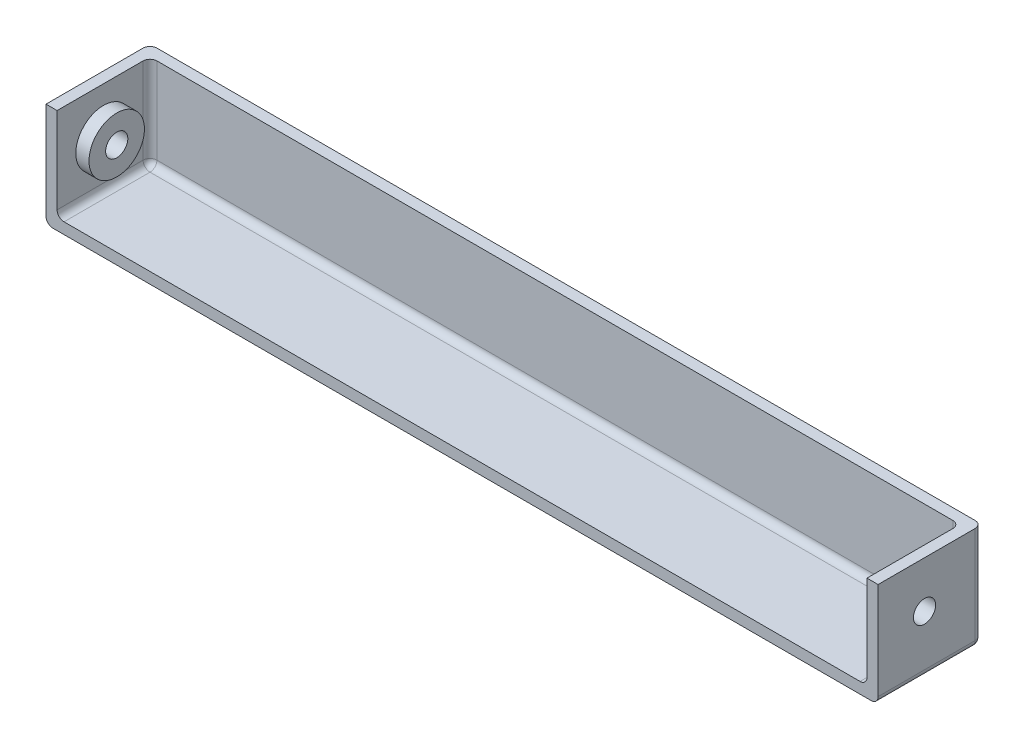
ISO-10303-21;
HEADER;
FILE_DESCRIPTION(('STEP AP214'),'2;1');
FILE_NAME('part.step','',(''),(''),'','','');
FILE_SCHEMA(('AUTOMOTIVE_DESIGN { 1 0 10303 214 1 1 1 1 }'));
ENDSEC;
DATA;
#1=APPLICATION_CONTEXT('core data for automotive mechanical design processes');
#2=APPLICATION_PROTOCOL_DEFINITION('international standard','automotive_design',2000,#1);
#3=PRODUCT_CONTEXT('',#1,'mechanical');
#4=PRODUCT('Part','Part','',(#3));
#5=PRODUCT_RELATED_PRODUCT_CATEGORY('part','',(#4));
#6=PRODUCT_DEFINITION_FORMATION('','',#4);
#7=PRODUCT_DEFINITION_CONTEXT('part definition',#1,'design');
#8=PRODUCT_DEFINITION('design','',#6,#7);
#9=PRODUCT_DEFINITION_SHAPE('','',#8);
#10=(LENGTH_UNIT() NAMED_UNIT(*) SI_UNIT(.MILLI.,.METRE.));
#11=(NAMED_UNIT(*) PLANE_ANGLE_UNIT() SI_UNIT($,.RADIAN.));
#12=(NAMED_UNIT(*) SI_UNIT($,.STERADIAN.) SOLID_ANGLE_UNIT());
#13=UNCERTAINTY_MEASURE_WITH_UNIT(LENGTH_MEASURE(1.E-05),#10,'distance_accuracy_value','');
#14=(GEOMETRIC_REPRESENTATION_CONTEXT(3) GLOBAL_UNCERTAINTY_ASSIGNED_CONTEXT((#13)) GLOBAL_UNIT_ASSIGNED_CONTEXT((#10,
#11,#12)) REPRESENTATION_CONTEXT('',''));
#15=CARTESIAN_POINT('',(0.,0.,0.));
#16=DIRECTION('',(0.,0.,1.));
#17=DIRECTION('',(1.,0.,0.));
#18=AXIS2_PLACEMENT_3D('',#15,#16,#17);
#19=CARTESIAN_POINT('',(-60.,0.,-1.6));
#20=DIRECTION('',(-1.,0.,0.));
#21=DIRECTION('',(0.,0.,1.));
#22=AXIS2_PLACEMENT_3D('',#19,#20,#21);
#23=PLANE('',#22);
#24=DIRECTION('',(0.,-1.,0.));
#25=VECTOR('',#24,1.);
#26=CARTESIAN_POINT('',(-60.,0.,-0.6));
#27=LINE('',#26,#25);
#28=CARTESIAN_POINT('',(-60.,15.,-0.6));
#29=VERTEX_POINT('',#28);
#30=CARTESIAN_POINT('',(-60.,1.,-0.6));
#31=VERTEX_POINT('',#30);
#32=EDGE_CURVE('E212',#29,#31,#27,.T.);
#33=ORIENTED_EDGE('',*,*,#32,.T.);
#34=DIRECTION('',(0.,0.,1.));
#35=VECTOR('',#34,1.);
#36=CARTESIAN_POINT('',(-60.,1.,-1.6));
#37=LINE('',#36,#35);
#38=CARTESIAN_POINT('',(-60.,1.,13.4));
#39=VERTEX_POINT('',#38);
#40=EDGE_CURVE('E176',#31,#39,#37,.T.);
#41=ORIENTED_EDGE('',*,*,#40,.T.);
#42=DIRECTION('',(0.,-1.,0.));
#43=VECTOR('',#42,1.);
#44=CARTESIAN_POINT('',(-60.,15.,13.4));
#45=LINE('',#44,#43);
#46=CARTESIAN_POINT('',(-60.,15.,13.4));
#47=VERTEX_POINT('',#46);
#48=EDGE_CURVE('E173',#47,#39,#45,.T.);
#49=ORIENTED_EDGE('',*,*,#48,.F.);
#50=DIRECTION('',(0.,0.,1.));
#51=VECTOR('',#50,1.);
#52=CARTESIAN_POINT('',(-60.,15.,-1.6));
#53=LINE('',#52,#51);
#54=EDGE_CURVE('E157',#29,#47,#53,.T.);
#55=ORIENTED_EDGE('',*,*,#54,.F.);
#56=EDGE_LOOP('',(#33,#41,#49,#55));
#57=FACE_BOUND('',#56,.T.);
#58=CARTESIAN_POINT('',(-60.,8.30000000000001,6.7));
#59=DIRECTION('',(-1.,0.,0.));
#60=DIRECTION('',(0.,-1.,0.));
#61=AXIS2_PLACEMENT_3D('',#58,#59,#60);
#62=CIRCLE('',#61,1.6);
#63=CARTESIAN_POINT('',(-60.,6.70000000000001,6.7));
#64=VERTEX_POINT('',#63);
#65=EDGE_CURVE('E348',#64,#64,#62,.T.);
#66=ORIENTED_EDGE('',*,*,#65,.F.);
#67=EDGE_LOOP('',(#66));
#68=FACE_BOUND('',#67,.T.);
#69=ADVANCED_FACE('F40',(#57,#68),#23,.T.);
#70=CARTESIAN_POINT('',(-56.5,8.30000000000001,6.7));
#71=DIRECTION('',(1.,0.,0.));
#72=DIRECTION('',(0.,-1.,0.));
#73=AXIS2_PLACEMENT_3D('',#70,#71,#72);
#74=PLANE('',#73);
#75=CARTESIAN_POINT('',(-56.5,8.30000000000001,6.7));
#76=DIRECTION('',(-1.,0.,0.));
#77=DIRECTION('',(0.,-1.,0.));
#78=AXIS2_PLACEMENT_3D('',#75,#76,#77);
#79=CIRCLE('',#78,4.);
#80=CARTESIAN_POINT('',(-56.5,4.30000000000001,6.7));
#81=VERTEX_POINT('',#80);
#82=EDGE_CURVE('E339',#81,#81,#79,.T.);
#83=ORIENTED_EDGE('',*,*,#82,.F.);
#84=EDGE_LOOP('',(#83));
#85=FACE_BOUND('',#84,.T.);
#86=CARTESIAN_POINT('',(-56.5,8.30000000000001,6.7));
#87=DIRECTION('',(-1.,0.,0.));
#88=DIRECTION('',(0.,-1.,0.));
#89=AXIS2_PLACEMENT_3D('',#86,#87,#88);
#90=CIRCLE('',#89,1.6);
#91=CARTESIAN_POINT('',(-56.5,6.70000000000001,6.7));
#92=VERTEX_POINT('',#91);
#93=EDGE_CURVE('E277',#92,#92,#90,.T.);
#94=ORIENTED_EDGE('',*,*,#93,.T.);
#95=EDGE_LOOP('',(#94));
#96=FACE_BOUND('',#95,.T.);
#97=ADVANCED_FACE('F359',(#85,#96),#74,.T.);
#98=CARTESIAN_POINT('',(58.4,15.,13.4));
#99=DIRECTION('',(1.,0.,0.));
#100=DIRECTION('',(0.,1.,0.));
#101=AXIS2_PLACEMENT_3D('',#98,#99,#100);
#102=PLANE('',#101);
#103=DIRECTION('',(0.,-1.,0.));
#104=VECTOR('',#103,1.);
#105=CARTESIAN_POINT('',(58.4,1.6,0.999999999999999));
#106=LINE('',#105,#104);
#107=CARTESIAN_POINT('',(58.4,15.,0.999999999999999));
#108=VERTEX_POINT('',#107);
#109=CARTESIAN_POINT('',(58.4,2.6,0.999999999999999));
#110=VERTEX_POINT('',#109);
#111=EDGE_CURVE('E238',#108,#110,#106,.T.);
#112=ORIENTED_EDGE('',*,*,#111,.T.);
#113=DIRECTION('',(0.,0.,-1.));
#114=VECTOR('',#113,1.);
#115=CARTESIAN_POINT('',(58.4,2.6,13.4));
#116=LINE('',#115,#114);
#117=CARTESIAN_POINT('',(58.4,2.6,13.4));
#118=VERTEX_POINT('',#117);
#119=EDGE_CURVE('E63',#110,#118,#116,.F.);
#120=ORIENTED_EDGE('',*,*,#119,.T.);
#121=DIRECTION('',(0.,-1.,0.));
#122=VECTOR('',#121,1.);
#123=CARTESIAN_POINT('',(58.4,15.,13.4));
#124=LINE('',#123,#122);
#125=CARTESIAN_POINT('',(58.4,15.,13.4));
#126=VERTEX_POINT('',#125);
#127=EDGE_CURVE('E182',#126,#118,#124,.T.);
#128=ORIENTED_EDGE('',*,*,#127,.F.);
#129=DIRECTION('',(0.,0.,-1.));
#130=VECTOR('',#129,1.);
#131=CARTESIAN_POINT('',(58.4,15.,13.4));
#132=LINE('',#131,#130);
#133=EDGE_CURVE('E192',#126,#108,#132,.T.);
#134=ORIENTED_EDGE('',*,*,#133,.T.);
#135=EDGE_LOOP('',(#112,#120,#128,#134));
#136=FACE_BOUND('',#135,.T.);
#137=CARTESIAN_POINT('',(58.4,8.30000000000001,6.7));
#138=DIRECTION('',(1.,0.,0.));
#139=DIRECTION('',(0.,1.,0.));
#140=AXIS2_PLACEMENT_3D('',#137,#138,#139);
#141=CIRCLE('',#140,4.);
#142=CARTESIAN_POINT('',(58.4,12.3,6.7));
#143=VERTEX_POINT('',#142);
#144=EDGE_CURVE('E168',#143,#143,#141,.F.);
#145=ORIENTED_EDGE('',*,*,#144,.F.);
#146=EDGE_LOOP('',(#145));
#147=FACE_BOUND('',#146,.T.);
#148=ADVANCED_FACE('F321',(#136,#147),#102,.F.);
#149=CARTESIAN_POINT('',(-60.,15.,0.));
#150=DIRECTION('',(0.,0.,-1.));
#151=DIRECTION('',(-1.,0.,0.));
#152=AXIS2_PLACEMENT_3D('',#149,#150,#151);
#153=PLANE('',#152);
#154=DIRECTION('',(1.,0.,0.));
#155=VECTOR('',#154,1.);
#156=CARTESIAN_POINT('',(-60.,2.6,0.));
#157=LINE('',#156,#155);
#158=CARTESIAN_POINT('',(-57.4,2.6,0.));
#159=VERTEX_POINT('',#158);
#160=CARTESIAN_POINT('',(57.4,2.6,0.));
#161=VERTEX_POINT('',#160);
#162=EDGE_CURVE('E243',#159,#161,#157,.T.);
#163=ORIENTED_EDGE('',*,*,#162,.T.);
#164=DIRECTION('',(0.,-1.,0.));
#165=VECTOR('',#164,1.);
#166=CARTESIAN_POINT('',(57.4,15.,0.));
#167=LINE('',#166,#165);
#168=CARTESIAN_POINT('',(57.4,15.,0.));
#169=VERTEX_POINT('',#168);
#170=EDGE_CURVE('E246',#161,#169,#167,.F.);
#171=ORIENTED_EDGE('',*,*,#170,.T.);
#172=DIRECTION('',(-1.,0.,0.));
#173=VECTOR('',#172,1.);
#174=CARTESIAN_POINT('',(-60.,15.,0.));
#175=LINE('',#174,#173);
#176=CARTESIAN_POINT('',(-57.4,15.,0.));
#177=VERTEX_POINT('',#176);
#178=EDGE_CURVE('E201',#169,#177,#175,.T.);
#179=ORIENTED_EDGE('',*,*,#178,.T.);
#180=DIRECTION('',(0.,-1.,0.));
#181=VECTOR('',#180,1.);
#182=CARTESIAN_POINT('',(-57.4,15.,0.));
#183=LINE('',#182,#181);
#184=EDGE_CURVE('E240',#177,#159,#183,.T.);
#185=ORIENTED_EDGE('',*,*,#184,.T.);
#186=EDGE_LOOP('',(#163,#171,#179,#185));
#187=FACE_BOUND('',#186,.T.);
#188=ADVANCED_FACE('F331',(#187),#153,.F.);
#189=CARTESIAN_POINT('',(-60.,15.,-1.6));
#190=DIRECTION('',(0.,1.,0.));
#191=DIRECTION('',(-1.,0.,0.));
#192=AXIS2_PLACEMENT_3D('',#189,#190,#191);
#193=PLANE('',#192);
#194=DIRECTION('',(-1.,0.,0.));
#195=VECTOR('',#194,1.);
#196=CARTESIAN_POINT('',(-60.,15.,-1.6));
#197=LINE('',#196,#195);
#198=CARTESIAN_POINT('',(59.,15.,-1.6));
#199=VERTEX_POINT('',#198);
#200=CARTESIAN_POINT('',(-59.,15.,-1.6));
#201=VERTEX_POINT('',#200);
#202=EDGE_CURVE('E202',#199,#201,#197,.T.);
#203=ORIENTED_EDGE('',*,*,#202,.T.);
#204=CARTESIAN_POINT('',(-59.,15.,-0.6));
#205=DIRECTION('',(0.,1.,0.));
#206=DIRECTION('',(-1.,0.,0.));
#207=AXIS2_PLACEMENT_3D('',#204,#205,#206);
#208=CIRCLE('',#207,1.);
#209=EDGE_CURVE('E165',#201,#29,#208,.T.);
#210=ORIENTED_EDGE('',*,*,#209,.T.);
#211=ORIENTED_EDGE('',*,*,#54,.T.);
#212=DIRECTION('',(1.,0.,0.));
#213=VECTOR('',#212,1.);
#214=CARTESIAN_POINT('',(-60.,15.,13.4));
#215=LINE('',#214,#213);
#216=CARTESIAN_POINT('',(-58.4,15.,13.4));
#217=VERTEX_POINT('',#216);
#218=EDGE_CURVE('E163',#47,#217,#215,.T.);
#219=ORIENTED_EDGE('',*,*,#218,.T.);
#220=DIRECTION('',(0.,0.,-1.));
#221=VECTOR('',#220,1.);
#222=CARTESIAN_POINT('',(-58.4,15.,13.4));
#223=LINE('',#222,#221);
#224=CARTESIAN_POINT('',(-58.4,15.,0.999999999999999));
#225=VERTEX_POINT('',#224);
#226=EDGE_CURVE('E177',#217,#225,#223,.T.);
#227=ORIENTED_EDGE('',*,*,#226,.T.);
#228=CARTESIAN_POINT('',(-57.4,15.,1.));
#229=DIRECTION('',(0.,1.,0.));
#230=DIRECTION('',(-1.,0.,0.));
#231=AXIS2_PLACEMENT_3D('',#228,#229,#230);
#232=CIRCLE('',#231,1.);
#233=EDGE_CURVE('E255',#225,#177,#232,.F.);
#234=ORIENTED_EDGE('',*,*,#233,.T.);
#235=ORIENTED_EDGE('',*,*,#178,.F.);
#236=CARTESIAN_POINT('',(57.4,15.,0.999999999999999));
#237=DIRECTION('',(0.,1.,0.));
#238=DIRECTION('',(-1.,0.,0.));
#239=AXIS2_PLACEMENT_3D('',#236,#237,#238);
#240=CIRCLE('',#239,1.);
#241=EDGE_CURVE('E253',#169,#108,#240,.F.);
#242=ORIENTED_EDGE('',*,*,#241,.T.);
#243=ORIENTED_EDGE('',*,*,#133,.F.);
#244=DIRECTION('',(-1.,0.,0.));
#245=VECTOR('',#244,1.);
#246=CARTESIAN_POINT('',(60.,15.,13.4));
#247=LINE('',#246,#245);
#248=CARTESIAN_POINT('',(60.,15.,13.4));
#249=VERTEX_POINT('',#248);
#250=EDGE_CURVE('E190',#249,#126,#247,.T.);
#251=ORIENTED_EDGE('',*,*,#250,.F.);
#252=DIRECTION('',(0.,0.,1.));
#253=VECTOR('',#252,1.);
#254=CARTESIAN_POINT('',(60.,15.,-1.6));
#255=LINE('',#254,#253);
#256=CARTESIAN_POINT('',(60.,15.,-0.6));
#257=VERTEX_POINT('',#256);
#258=EDGE_CURVE('E169',#257,#249,#255,.T.);
#259=ORIENTED_EDGE('',*,*,#258,.F.);
#260=CARTESIAN_POINT('',(59.,15.,-0.6));
#261=DIRECTION('',(0.,1.,0.));
#262=DIRECTION('',(-1.,0.,0.));
#263=AXIS2_PLACEMENT_3D('',#260,#261,#262);
#264=CIRCLE('',#263,1.);
#265=EDGE_CURVE('E231',#257,#199,#264,.T.);
#266=ORIENTED_EDGE('',*,*,#265,.T.);
#267=EDGE_LOOP('',(#203,#210,#211,#219,#227,#234,#235,#242,#243,#251,#259,#266));
#268=FACE_BOUND('',#267,.T.);
#269=ADVANCED_FACE('F160',(#268),#193,.T.);
#270=CARTESIAN_POINT('',(60.,0.,-1.6));
#271=DIRECTION('',(1.,0.,0.));
#272=DIRECTION('',(0.,0.,-1.));
#273=AXIS2_PLACEMENT_3D('',#270,#271,#272);
#274=PLANE('',#273);
#275=CARTESIAN_POINT('',(60.,8.30000000000001,6.7));
#276=DIRECTION('',(-1.,0.,0.));
#277=DIRECTION('',(0.,-1.,0.));
#278=AXIS2_PLACEMENT_3D('',#275,#276,#277);
#279=CIRCLE('',#278,1.6);
#280=CARTESIAN_POINT('',(60.,6.70000000000001,6.7));
#281=VERTEX_POINT('',#280);
#282=EDGE_CURVE('E344',#281,#281,#279,.T.);
#283=ORIENTED_EDGE('',*,*,#282,.T.);
#284=EDGE_LOOP('',(#283));
#285=FACE_BOUND('',#284,.T.);
#286=DIRECTION('',(0.,-1.,0.));
#287=VECTOR('',#286,1.);
#288=CARTESIAN_POINT('',(60.,15.,13.4));
#289=LINE('',#288,#287);
#290=CARTESIAN_POINT('',(60.,1.00000000000001,13.4));
#291=VERTEX_POINT('',#290);
#292=EDGE_CURVE('E187',#249,#291,#289,.T.);
#293=ORIENTED_EDGE('',*,*,#292,.T.);
#294=DIRECTION('',(0.,0.,1.));
#295=VECTOR('',#294,1.);
#296=CARTESIAN_POINT('',(60.,1.00000000000001,-1.6));
#297=LINE('',#296,#295);
#298=CARTESIAN_POINT('',(60.,1.00000000000001,-0.6));
#299=VERTEX_POINT('',#298);
#300=EDGE_CURVE('E236',#291,#299,#297,.F.);
#301=ORIENTED_EDGE('',*,*,#300,.T.);
#302=DIRECTION('',(0.,1.,0.));
#303=VECTOR('',#302,1.);
#304=CARTESIAN_POINT('',(60.,0.,-0.6));
#305=LINE('',#304,#303);
#306=EDGE_CURVE('E234',#299,#257,#305,.T.);
#307=ORIENTED_EDGE('',*,*,#306,.T.);
#308=ORIENTED_EDGE('',*,*,#258,.T.);
#309=EDGE_LOOP('',(#293,#301,#307,#308));
#310=FACE_BOUND('',#309,.T.);
#311=ADVANCED_FACE('F536',(#285,#310),#274,.T.);
#312=CARTESIAN_POINT('',(-60.,0.,-1.6));
#313=DIRECTION('',(0.,-1.,0.));
#314=DIRECTION('',(1.,0.,0.));
#315=AXIS2_PLACEMENT_3D('',#312,#313,#314);
#316=PLANE('',#315);
#317=DIRECTION('',(1.,0.,0.));
#318=VECTOR('',#317,1.);
#319=CARTESIAN_POINT('',(-58.4,0.,13.4));
#320=LINE('',#319,#318);
#321=CARTESIAN_POINT('',(-59.,0.,13.4));
#322=VERTEX_POINT('',#321);
#323=CARTESIAN_POINT('',(59.,0.,13.4));
#324=VERTEX_POINT('',#323);
#325=EDGE_CURVE('E195',#322,#324,#320,.T.);
#326=ORIENTED_EDGE('',*,*,#325,.F.);
#327=DIRECTION('',(0.,0.,1.));
#328=VECTOR('',#327,1.);
#329=CARTESIAN_POINT('',(-59.,0.,-1.6));
#330=LINE('',#329,#328);
#331=CARTESIAN_POINT('',(-59.,0.,-0.6));
#332=VERTEX_POINT('',#331);
#333=EDGE_CURVE('E223',#322,#332,#330,.F.);
#334=ORIENTED_EDGE('',*,*,#333,.T.);
#335=DIRECTION('',(1.,0.,0.));
#336=VECTOR('',#335,1.);
#337=CARTESIAN_POINT('',(-60.,0.,-0.6));
#338=LINE('',#337,#336);
#339=CARTESIAN_POINT('',(59.,0.,-0.6));
#340=VERTEX_POINT('',#339);
#341=EDGE_CURVE('E221',#332,#340,#338,.T.);
#342=ORIENTED_EDGE('',*,*,#341,.T.);
#343=DIRECTION('',(0.,0.,1.));
#344=VECTOR('',#343,1.);
#345=CARTESIAN_POINT('',(59.,0.,-1.6));
#346=LINE('',#345,#344);
#347=EDGE_CURVE('E219',#340,#324,#346,.T.);
#348=ORIENTED_EDGE('',*,*,#347,.T.);
#349=EDGE_LOOP('',(#326,#334,#342,#348));
#350=FACE_BOUND('',#349,.T.);
#351=ADVANCED_FACE('F368',(#350),#316,.T.);
#352=CARTESIAN_POINT('',(-60.,15.,-1.6));
#353=DIRECTION('',(0.,0.,-1.));
#354=DIRECTION('',(-1.,0.,0.));
#355=AXIS2_PLACEMENT_3D('',#352,#353,#354);
#356=PLANE('',#355);
#357=DIRECTION('',(1.,0.,0.));
#358=VECTOR('',#357,1.);
#359=CARTESIAN_POINT('',(-60.,1.,-1.6));
#360=LINE('',#359,#358);
#361=CARTESIAN_POINT('',(59.,1.00000000000001,-1.6));
#362=VERTEX_POINT('',#361);
#363=CARTESIAN_POINT('',(-59.,1.,-1.6));
#364=VERTEX_POINT('',#363);
#365=EDGE_CURVE('E227',#362,#364,#360,.F.);
#366=ORIENTED_EDGE('',*,*,#365,.T.);
#367=DIRECTION('',(0.,-1.,0.));
#368=VECTOR('',#367,1.);
#369=CARTESIAN_POINT('',(-59.,15.,-1.6));
#370=LINE('',#369,#368);
#371=EDGE_CURVE('E229',#364,#201,#370,.F.);
#372=ORIENTED_EDGE('',*,*,#371,.T.);
#373=ORIENTED_EDGE('',*,*,#202,.F.);
#374=DIRECTION('',(0.,1.,0.));
#375=VECTOR('',#374,1.);
#376=CARTESIAN_POINT('',(59.,15.,-1.6));
#377=LINE('',#376,#375);
#378=EDGE_CURVE('E225',#199,#362,#377,.F.);
#379=ORIENTED_EDGE('',*,*,#378,.T.);
#380=EDGE_LOOP('',(#366,#372,#373,#379));
#381=FACE_BOUND('',#380,.T.);
#382=ADVANCED_FACE('F522',(#381),#356,.T.);
#383=CARTESIAN_POINT('',(-58.4,1.6,13.4));
#384=DIRECTION('',(0.,1.,0.));
#385=DIRECTION('',(0.,0.,1.));
#386=AXIS2_PLACEMENT_3D('',#383,#384,#385);
#387=PLANE('',#386);
#388=DIRECTION('',(1.,0.,0.));
#389=VECTOR('',#388,1.);
#390=CARTESIAN_POINT('',(-58.4,1.6,13.4));
#391=LINE('',#390,#389);
#392=CARTESIAN_POINT('',(-57.4,1.6,13.4));
#393=VERTEX_POINT('',#392);
#394=CARTESIAN_POINT('',(57.4,1.6,13.4));
#395=VERTEX_POINT('',#394);
#396=EDGE_CURVE('E198',#393,#395,#391,.T.);
#397=ORIENTED_EDGE('',*,*,#396,.T.);
#398=DIRECTION('',(0.,0.,-1.));
#399=VECTOR('',#398,1.);
#400=CARTESIAN_POINT('',(57.4,1.6,13.4));
#401=LINE('',#400,#399);
#402=CARTESIAN_POINT('',(57.4,1.6,0.999999999999999));
#403=VERTEX_POINT('',#402);
#404=EDGE_CURVE('E289',#395,#403,#401,.T.);
#405=ORIENTED_EDGE('',*,*,#404,.T.);
#406=DIRECTION('',(1.,0.,0.));
#407=VECTOR('',#406,1.);
#408=CARTESIAN_POINT('',(-58.4,1.6,0.999999999999999));
#409=LINE('',#408,#407);
#410=CARTESIAN_POINT('',(-57.4,1.6,0.999999999999999));
#411=VERTEX_POINT('',#410);
#412=EDGE_CURVE('E248',#403,#411,#409,.F.);
#413=ORIENTED_EDGE('',*,*,#412,.T.);
#414=DIRECTION('',(0.,0.,-1.));
#415=VECTOR('',#414,1.);
#416=CARTESIAN_POINT('',(-57.4,1.6,13.4));
#417=LINE('',#416,#415);
#418=EDGE_CURVE('E287',#411,#393,#417,.F.);
#419=ORIENTED_EDGE('',*,*,#418,.T.);
#420=EDGE_LOOP('',(#397,#405,#413,#419));
#421=FACE_BOUND('',#420,.T.);
#422=ADVANCED_FACE('F311',(#421),#387,.T.);
#423=CARTESIAN_POINT('',(58.4,0.,13.4));
#424=DIRECTION('',(0.,0.,-1.));
#425=DIRECTION('',(-1.,0.,0.));
#426=AXIS2_PLACEMENT_3D('',#423,#424,#425);
#427=PLANE('',#426);
#428=ORIENTED_EDGE('',*,*,#48,.T.);
#429=CARTESIAN_POINT('',(-59.,1.,13.4));
#430=DIRECTION('',(0.,0.,-1.));
#431=DIRECTION('',(-1.,0.,0.));
#432=AXIS2_PLACEMENT_3D('',#429,#430,#431);
#433=CIRCLE('',#432,1.);
#434=EDGE_CURVE('E217',#39,#322,#433,.F.);
#435=ORIENTED_EDGE('',*,*,#434,.T.);
#436=ORIENTED_EDGE('',*,*,#325,.T.);
#437=CARTESIAN_POINT('',(59.,1.00000000000001,13.4));
#438=DIRECTION('',(0.,0.,-1.));
#439=DIRECTION('',(-1.,0.,0.));
#440=AXIS2_PLACEMENT_3D('',#437,#438,#439);
#441=CIRCLE('',#440,1.);
#442=EDGE_CURVE('E215',#324,#291,#441,.F.);
#443=ORIENTED_EDGE('',*,*,#442,.T.);
#444=ORIENTED_EDGE('',*,*,#292,.F.);
#445=ORIENTED_EDGE('',*,*,#250,.T.);
#446=ORIENTED_EDGE('',*,*,#127,.T.);
#447=CARTESIAN_POINT('',(57.4,2.6,13.4));
#448=DIRECTION('',(0.,0.,-1.));
#449=DIRECTION('',(-1.,0.,0.));
#450=AXIS2_PLACEMENT_3D('',#447,#448,#449);
#451=CIRCLE('',#450,1.);
#452=EDGE_CURVE('E49',#118,#395,#451,.T.);
#453=ORIENTED_EDGE('',*,*,#452,.T.);
#454=ORIENTED_EDGE('',*,*,#396,.F.);
#455=CARTESIAN_POINT('',(-57.4,2.6,13.4));
#456=DIRECTION('',(0.,0.,-1.));
#457=DIRECTION('',(-1.,0.,0.));
#458=AXIS2_PLACEMENT_3D('',#455,#456,#457);
#459=CIRCLE('',#458,1.);
#460=CARTESIAN_POINT('',(-58.4,2.6,13.4));
#461=VERTEX_POINT('',#460);
#462=EDGE_CURVE('E11',#393,#461,#459,.T.);
#463=ORIENTED_EDGE('',*,*,#462,.T.);
#464=DIRECTION('',(0.,-1.,0.));
#465=VECTOR('',#464,1.);
#466=CARTESIAN_POINT('',(-58.4,15.,13.4));
#467=LINE('',#466,#465);
#468=EDGE_CURVE('E180',#217,#461,#467,.T.);
#469=ORIENTED_EDGE('',*,*,#468,.F.);
#470=ORIENTED_EDGE('',*,*,#218,.F.);
#471=EDGE_LOOP('',(#428,#435,#436,#443,#444,#445,#446,#453,#454,#463,#469,#470));
#472=FACE_BOUND('',#471,.T.);
#473=ADVANCED_FACE('F179',(#472),#427,.F.);
#474=CARTESIAN_POINT('',(-58.4,15.,13.4));
#475=DIRECTION('',(1.,0.,0.));
#476=DIRECTION('',(0.,0.,-1.));
#477=AXIS2_PLACEMENT_3D('',#474,#475,#476);
#478=PLANE('',#477);
#479=CARTESIAN_POINT('',(-58.4,8.30000000000001,6.7));
#480=DIRECTION('',(1.,0.,0.));
#481=DIRECTION('',(0.,0.,-1.));
#482=AXIS2_PLACEMENT_3D('',#479,#480,#481);
#483=CIRCLE('',#482,4.);
#484=CARTESIAN_POINT('',(-58.4,4.30000000000001,6.7));
#485=VERTEX_POINT('',#484);
#486=EDGE_CURVE('E209',#485,#485,#483,.T.);
#487=ORIENTED_EDGE('',*,*,#486,.F.);
#488=EDGE_LOOP('',(#487));
#489=FACE_BOUND('',#488,.T.);
#490=ORIENTED_EDGE('',*,*,#468,.T.);
#491=DIRECTION('',(0.,0.,-1.));
#492=VECTOR('',#491,1.);
#493=CARTESIAN_POINT('',(-58.4,2.6,0.999999999999999));
#494=LINE('',#493,#492);
#495=CARTESIAN_POINT('',(-58.4,2.6,0.999999999999999));
#496=VERTEX_POINT('',#495);
#497=EDGE_CURVE('E292',#461,#496,#494,.T.);
#498=ORIENTED_EDGE('',*,*,#497,.T.);
#499=DIRECTION('',(0.,-1.,0.));
#500=VECTOR('',#499,1.);
#501=CARTESIAN_POINT('',(-58.4,15.,0.999999999999999));
#502=LINE('',#501,#500);
#503=EDGE_CURVE('E251',#496,#225,#502,.F.);
#504=ORIENTED_EDGE('',*,*,#503,.T.);
#505=ORIENTED_EDGE('',*,*,#226,.F.);
#506=EDGE_LOOP('',(#490,#498,#504,#505));
#507=FACE_BOUND('',#506,.T.);
#508=ADVANCED_FACE('F336',(#489,#507),#478,.T.);
#509=CARTESIAN_POINT('',(56.5,8.30000000000001,6.7));
#510=DIRECTION('',(1.,0.,0.));
#511=DIRECTION('',(0.,1.,0.));
#512=AXIS2_PLACEMENT_3D('',#509,#510,#511);
#513=CYLINDRICAL_SURFACE('',#512,4.);
#514=CARTESIAN_POINT('',(56.5,8.30000000000001,6.7));
#515=DIRECTION('',(-1.,0.,0.));
#516=DIRECTION('',(0.,-1.,0.));
#517=AXIS2_PLACEMENT_3D('',#514,#515,#516);
#518=CIRCLE('',#517,4.);
#519=CARTESIAN_POINT('',(56.5,12.3,6.7));
#520=VERTEX_POINT('',#519);
#521=EDGE_CURVE('E337',#520,#520,#518,.T.);
#522=CARTESIAN_POINT('',(56.5,12.3,6.7));
#523=CARTESIAN_POINT('',(56.5197916666667,12.3,6.7));
#524=CARTESIAN_POINT('',(56.5395833333333,12.3,6.7));
#525=CARTESIAN_POINT('',(56.5791666666667,12.3,6.7));
#526=CARTESIAN_POINT('',(56.5989583333333,12.3,6.7));
#527=CARTESIAN_POINT('',(56.6385416666667,12.3,6.7));
#528=CARTESIAN_POINT('',(56.6583333333333,12.3,6.7));
#529=CARTESIAN_POINT('',(56.6979166666667,12.3,6.7));
#530=CARTESIAN_POINT('',(56.7177083333333,12.3,6.7));
#531=CARTESIAN_POINT('',(56.7572916666667,12.3,6.7));
#532=CARTESIAN_POINT('',(56.7770833333333,12.3,6.7));
#533=CARTESIAN_POINT('',(56.8166666666667,12.3,6.7));
#534=CARTESIAN_POINT('',(56.8364583333333,12.3,6.7));
#535=CARTESIAN_POINT('',(56.8760416666667,12.3,6.7));
#536=CARTESIAN_POINT('',(56.8958333333333,12.3,6.7));
#537=CARTESIAN_POINT('',(56.9354166666667,12.3,6.7));
#538=CARTESIAN_POINT('',(56.9552083333333,12.3,6.7));
#539=CARTESIAN_POINT('',(56.9947916666667,12.3,6.7));
#540=CARTESIAN_POINT('',(57.0145833333333,12.3,6.7));
#541=CARTESIAN_POINT('',(57.0541666666667,12.3,6.7));
#542=CARTESIAN_POINT('',(57.0739583333334,12.3,6.7));
#543=CARTESIAN_POINT('',(57.1135416666667,12.3,6.7));
#544=CARTESIAN_POINT('',(57.1333333333333,12.3,6.7));
#545=CARTESIAN_POINT('',(57.1729166666667,12.3,6.7));
#546=CARTESIAN_POINT('',(57.1927083333333,12.3,6.7));
#547=CARTESIAN_POINT('',(57.2322916666667,12.3,6.7));
#548=CARTESIAN_POINT('',(57.2520833333334,12.3,6.7));
#549=CARTESIAN_POINT('',(57.2916666666667,12.3,6.7));
#550=CARTESIAN_POINT('',(57.3114583333333,12.3,6.7));
#551=CARTESIAN_POINT('',(57.3510416666667,12.3,6.7));
#552=CARTESIAN_POINT('',(57.3708333333334,12.3,6.7));
#553=CARTESIAN_POINT('',(57.4104166666667,12.3,6.7));
#554=CARTESIAN_POINT('',(57.4302083333333,12.3,6.7));
#555=CARTESIAN_POINT('',(57.4697916666667,12.3,6.7));
#556=CARTESIAN_POINT('',(57.4895833333333,12.3,6.7));
#557=CARTESIAN_POINT('',(57.5291666666667,12.3,6.7));
#558=CARTESIAN_POINT('',(57.5489583333333,12.3,6.7));
#559=CARTESIAN_POINT('',(57.5885416666667,12.3,6.7));
#560=CARTESIAN_POINT('',(57.6083333333333,12.3,6.7));
#561=CARTESIAN_POINT('',(57.6479166666667,12.3,6.7));
#562=CARTESIAN_POINT('',(57.6677083333333,12.3,6.7));
#563=CARTESIAN_POINT('',(57.7072916666667,12.3,6.7));
#564=CARTESIAN_POINT('',(57.7270833333333,12.3,6.7));
#565=CARTESIAN_POINT('',(57.7666666666667,12.3,6.7));
#566=CARTESIAN_POINT('',(57.7864583333333,12.3,6.7));
#567=CARTESIAN_POINT('',(57.8260416666667,12.3,6.7));
#568=CARTESIAN_POINT('',(57.8458333333333,12.3,6.7));
#569=CARTESIAN_POINT('',(57.8854166666667,12.3,6.7));
#570=CARTESIAN_POINT('',(57.9052083333333,12.3,6.7));
#571=CARTESIAN_POINT('',(57.9447916666667,12.3,6.7));
#572=CARTESIAN_POINT('',(57.9645833333333,12.3,6.7));
#573=CARTESIAN_POINT('',(58.0041666666667,12.3,6.7));
#574=CARTESIAN_POINT('',(58.0239583333333,12.3,6.7));
#575=CARTESIAN_POINT('',(58.0635416666667,12.3,6.7));
#576=CARTESIAN_POINT('',(58.0833333333333,12.3,6.7));
#577=CARTESIAN_POINT('',(58.1229166666667,12.3,6.7));
#578=CARTESIAN_POINT('',(58.1427083333333,12.3,6.7));
#579=CARTESIAN_POINT('',(58.1822916666667,12.3,6.7));
#580=CARTESIAN_POINT('',(58.2020833333333,12.3,6.7));
#581=CARTESIAN_POINT('',(58.2416666666667,12.3,6.7));
#582=CARTESIAN_POINT('',(58.2614583333334,12.3,6.7));
#583=CARTESIAN_POINT('',(58.3010416666667,12.3,6.7));
#584=CARTESIAN_POINT('',(58.3208333333333,12.3,6.7));
#585=CARTESIAN_POINT('',(58.3604166666667,12.3,6.7));
#586=CARTESIAN_POINT('',(58.3802083333333,12.3,6.7));
#587=CARTESIAN_POINT('',(58.4,12.3,6.7));
#588=B_SPLINE_CURVE_WITH_KNOTS('',3,(#522,#523,#524,#525,#526,#527,#528,#529,#530,#531,#532,
#533,#534,#535,#536,#537,#538,#539,#540,#541,#542,#543,#544,#545,#546,#547,#548,#549,#550,#551,
#552,#553,#554,#555,#556,#557,#558,#559,#560,#561,#562,#563,#564,#565,#566,#567,#568,#569,#570,
#571,#572,#573,#574,#575,#576,#577,#578,#579,#580,#581,#582,#583,#584,#585,#586,#587),
.UNSPECIFIED.,.F.,.F.,(4,2,2,2,2,2,2,2,2,2,2,2,2,2,2,2,2,2,2,2,2,2,2,2,2,2,2,2,2,2,2,2,4),(0.,
0.0593750000000004,0.118750000000001,0.178125000000001,0.237500000000002,0.296875000000002,
0.356250000000002,0.415625000000003,0.475000000000003,0.534375000000004,0.593750000000004,
0.653125000000004,0.712500000000005,0.771875000000005,0.831250000000006,0.890625000000006,
0.950000000000006,1.009375,1.06875,1.128125,1.1875,1.246875,1.30625,1.365625,1.425,1.484375,
1.54375,1.603125,1.6625,1.721875,1.78125000000001,1.84062500000001,1.90000000000001),.UNSPECIFIED.);
#589=EDGE_CURVE('BSEAM496',#520,#143,#588,.T.);
#590=ORIENTED_EDGE('',*,*,#521,.F.);
#591=ORIENTED_EDGE('',*,*,#144,.T.);
#592=ORIENTED_EDGE('',*,*,#589,.T.);
#593=ORIENTED_EDGE('',*,*,#589,.F.);
#594=EDGE_LOOP('',(#590,#592,#591,#593));
#595=FACE_BOUND('',#594,.T.);
#596=ADVANCED_FACE('F496',(#595),#513,.T.);
#597=CARTESIAN_POINT('',(56.5,8.30000000000001,6.7));
#598=DIRECTION('',(-1.,0.,0.));
#599=DIRECTION('',(0.,-1.,0.));
#600=AXIS2_PLACEMENT_3D('',#597,#598,#599);
#601=PLANE('',#600);
#602=CARTESIAN_POINT('',(56.5,8.30000000000001,6.7));
#603=DIRECTION('',(-1.,0.,0.));
#604=DIRECTION('',(0.,-1.,0.));
#605=AXIS2_PLACEMENT_3D('',#602,#603,#604);
#606=CIRCLE('',#605,1.6);
#607=CARTESIAN_POINT('',(56.5,6.70000000000001,6.7));
#608=VERTEX_POINT('',#607);
#609=EDGE_CURVE('E345',#608,#608,#606,.T.);
#610=ORIENTED_EDGE('',*,*,#609,.F.);
#611=EDGE_LOOP('',(#610));
#612=FACE_BOUND('',#611,.T.);
#613=ORIENTED_EDGE('',*,*,#521,.T.);
#614=EDGE_LOOP('',(#613));
#615=FACE_BOUND('',#614,.T.);
#616=ADVANCED_FACE('F488',(#612,#615),#601,.T.);
#617=CARTESIAN_POINT('',(-56.5,8.30000000000001,6.7));
#618=DIRECTION('',(-1.,0.,0.));
#619=DIRECTION('',(0.,-1.,0.));
#620=AXIS2_PLACEMENT_3D('',#617,#618,#619);
#621=CYLINDRICAL_SURFACE('',#620,4.);
#622=CARTESIAN_POINT('',(-56.5,4.30000000000001,6.7));
#623=CARTESIAN_POINT('',(-56.5197916666667,4.30000000000001,6.7));
#624=CARTESIAN_POINT('',(-56.5395833333334,4.30000000000001,6.7));
#625=CARTESIAN_POINT('',(-56.5791666666667,4.30000000000001,6.7));
#626=CARTESIAN_POINT('',(-56.5989583333333,4.30000000000001,6.7));
#627=CARTESIAN_POINT('',(-56.6385416666667,4.30000000000001,6.7));
#628=CARTESIAN_POINT('',(-56.6583333333334,4.30000000000001,6.7));
#629=CARTESIAN_POINT('',(-56.6979166666667,4.30000000000001,6.7));
#630=CARTESIAN_POINT('',(-56.7177083333334,4.30000000000001,6.7));
#631=CARTESIAN_POINT('',(-56.7572916666667,4.30000000000001,6.7));
#632=CARTESIAN_POINT('',(-56.7770833333334,4.30000000000001,6.7));
#633=CARTESIAN_POINT('',(-56.8166666666667,4.30000000000001,6.7));
#634=CARTESIAN_POINT('',(-56.8364583333333,4.30000000000001,6.7));
#635=CARTESIAN_POINT('',(-56.8760416666667,4.30000000000001,6.7));
#636=CARTESIAN_POINT('',(-56.8958333333333,4.30000000000001,6.7));
#637=CARTESIAN_POINT('',(-56.9354166666667,4.30000000000001,6.7));
#638=CARTESIAN_POINT('',(-56.9552083333333,4.30000000000001,6.7));
#639=CARTESIAN_POINT('',(-56.9947916666667,4.30000000000001,6.7));
#640=CARTESIAN_POINT('',(-57.0145833333333,4.30000000000001,6.7));
#641=CARTESIAN_POINT('',(-57.0541666666667,4.30000000000001,6.7));
#642=CARTESIAN_POINT('',(-57.0739583333334,4.30000000000001,6.7));
#643=CARTESIAN_POINT('',(-57.1135416666667,4.30000000000001,6.7));
#644=CARTESIAN_POINT('',(-57.1333333333333,4.30000000000001,6.7));
#645=CARTESIAN_POINT('',(-57.1729166666667,4.30000000000001,6.7));
#646=CARTESIAN_POINT('',(-57.1927083333333,4.30000000000001,6.7));
#647=CARTESIAN_POINT('',(-57.2322916666667,4.30000000000001,6.7));
#648=CARTESIAN_POINT('',(-57.2520833333333,4.30000000000001,6.7));
#649=CARTESIAN_POINT('',(-57.2916666666667,4.30000000000001,6.7));
#650=CARTESIAN_POINT('',(-57.3114583333333,4.30000000000001,6.7));
#651=CARTESIAN_POINT('',(-57.3510416666667,4.30000000000001,6.7));
#652=CARTESIAN_POINT('',(-57.3708333333333,4.30000000000001,6.7));
#653=CARTESIAN_POINT('',(-57.4104166666667,4.30000000000001,6.7));
#654=CARTESIAN_POINT('',(-57.4302083333333,4.30000000000001,6.7));
#655=CARTESIAN_POINT('',(-57.4697916666667,4.30000000000001,6.7));
#656=CARTESIAN_POINT('',(-57.4895833333333,4.30000000000001,6.7));
#657=CARTESIAN_POINT('',(-57.5291666666667,4.30000000000001,6.7));
#658=CARTESIAN_POINT('',(-57.5489583333333,4.30000000000001,6.7));
#659=CARTESIAN_POINT('',(-57.5885416666667,4.30000000000001,6.7));
#660=CARTESIAN_POINT('',(-57.6083333333333,4.30000000000001,6.7));
#661=CARTESIAN_POINT('',(-57.6479166666667,4.30000000000001,6.7));
#662=CARTESIAN_POINT('',(-57.6677083333333,4.30000000000001,6.7));
#663=CARTESIAN_POINT('',(-57.7072916666667,4.30000000000001,6.7));
#664=CARTESIAN_POINT('',(-57.7270833333333,4.30000000000001,6.7));
#665=CARTESIAN_POINT('',(-57.7666666666667,4.30000000000001,6.7));
#666=CARTESIAN_POINT('',(-57.7864583333333,4.30000000000001,6.7));
#667=CARTESIAN_POINT('',(-57.8260416666667,4.30000000000001,6.7));
#668=CARTESIAN_POINT('',(-57.8458333333333,4.30000000000001,6.7));
#669=CARTESIAN_POINT('',(-57.8854166666667,4.30000000000001,6.7));
#670=CARTESIAN_POINT('',(-57.9052083333333,4.30000000000001,6.7));
#671=CARTESIAN_POINT('',(-57.9447916666667,4.30000000000001,6.7));
#672=CARTESIAN_POINT('',(-57.9645833333333,4.30000000000001,6.7));
#673=CARTESIAN_POINT('',(-58.0041666666667,4.30000000000001,6.7));
#674=CARTESIAN_POINT('',(-58.0239583333333,4.30000000000001,6.7));
#675=CARTESIAN_POINT('',(-58.0635416666667,4.30000000000001,6.7));
#676=CARTESIAN_POINT('',(-58.0833333333333,4.30000000000001,6.7));
#677=CARTESIAN_POINT('',(-58.1229166666667,4.30000000000001,6.7));
#678=CARTESIAN_POINT('',(-58.1427083333333,4.30000000000001,6.7));
#679=CARTESIAN_POINT('',(-58.1822916666667,4.30000000000001,6.7));
#680=CARTESIAN_POINT('',(-58.2020833333333,4.30000000000001,6.7));
#681=CARTESIAN_POINT('',(-58.2416666666667,4.30000000000001,6.7));
#682=CARTESIAN_POINT('',(-58.2614583333333,4.30000000000001,6.7));
#683=CARTESIAN_POINT('',(-58.3010416666667,4.30000000000001,6.7));
#684=CARTESIAN_POINT('',(-58.3208333333333,4.30000000000001,6.7));
#685=CARTESIAN_POINT('',(-58.3604166666667,4.30000000000001,6.7));
#686=CARTESIAN_POINT('',(-58.3802083333333,4.30000000000001,6.7));
#687=CARTESIAN_POINT('',(-58.4,4.30000000000001,6.7));
#688=B_SPLINE_CURVE_WITH_KNOTS('',3,(#622,#623,#624,#625,#626,#627,#628,#629,#630,#631,#632,
#633,#634,#635,#636,#637,#638,#639,#640,#641,#642,#643,#644,#645,#646,#647,#648,#649,#650,#651,
#652,#653,#654,#655,#656,#657,#658,#659,#660,#661,#662,#663,#664,#665,#666,#667,#668,#669,#670,
#671,#672,#673,#674,#675,#676,#677,#678,#679,#680,#681,#682,#683,#684,#685,#686,#687),
.UNSPECIFIED.,.F.,.F.,(4,2,2,2,2,2,2,2,2,2,2,2,2,2,2,2,2,2,2,2,2,2,2,2,2,2,2,2,2,2,2,2,4),(0.,
0.0593749999999935,0.118749999999994,0.178124999999994,0.237499999999995,0.296874999999995,
0.356249999999989,0.415624999999989,0.474999999999989,0.53437499999999,0.59374999999999,
0.653124999999984,0.712499999999984,0.771874999999984,0.831249999999985,0.890624999999985,
0.949999999999979,1.00937499999998,1.06874999999998,1.12812499999998,1.18749999999998,
1.24687499999998,1.30624999999997,1.36562499999997,1.42499999999997,1.48437499999998,
1.54374999999998,1.60312499999997,1.66249999999997,1.72187499999997,1.78124999999997,
1.84062499999997,1.89999999999996),.UNSPECIFIED.);
#689=EDGE_CURVE('BSEAM479',#81,#485,#688,.T.);
#690=ORIENTED_EDGE('',*,*,#82,.T.);
#691=ORIENTED_EDGE('',*,*,#486,.T.);
#692=ORIENTED_EDGE('',*,*,#689,.T.);
#693=ORIENTED_EDGE('',*,*,#689,.F.);
#694=EDGE_LOOP('',(#690,#692,#691,#693));
#695=FACE_BOUND('',#694,.T.);
#696=ADVANCED_FACE('F479',(#695),#621,.T.);
#697=CARTESIAN_POINT('',(60.,8.30000000000001,6.7));
#698=DIRECTION('',(-1.,0.,0.));
#699=DIRECTION('',(0.,-1.,0.));
#700=AXIS2_PLACEMENT_3D('',#697,#698,#699);
#701=CYLINDRICAL_SURFACE('',#700,1.6);
#702=ORIENTED_EDGE('',*,*,#282,.F.);
#703=EDGE_LOOP('',(#702));
#704=FACE_BOUND('',#703,.T.);
#705=ORIENTED_EDGE('',*,*,#609,.T.);
#706=EDGE_LOOP('',(#705));
#707=FACE_BOUND('',#706,.T.);
#708=ADVANCED_FACE('F471',(#704,#707),#701,.F.);
#709=CARTESIAN_POINT('',(-60.,8.30000000000001,6.7));
#710=DIRECTION('',(1.,0.,0.));
#711=DIRECTION('',(0.,1.,0.));
#712=AXIS2_PLACEMENT_3D('',#709,#710,#711);
#713=CYLINDRICAL_SURFACE('',#712,1.6);
#714=ORIENTED_EDGE('',*,*,#65,.T.);
#715=EDGE_LOOP('',(#714));
#716=FACE_BOUND('',#715,.T.);
#717=ORIENTED_EDGE('',*,*,#93,.F.);
#718=EDGE_LOOP('',(#717));
#719=FACE_BOUND('',#718,.T.);
#720=ADVANCED_FACE('F356',(#716,#719),#713,.F.);
#721=CARTESIAN_POINT('',(59.,1.00000000000001,-1.6));
#722=DIRECTION('',(0.,0.,1.));
#723=DIRECTION('',(1.,0.,0.));
#724=AXIS2_PLACEMENT_3D('',#721,#722,#723);
#725=CYLINDRICAL_SURFACE('',#724,1.);
#726=ORIENTED_EDGE('',*,*,#442,.F.);
#727=ORIENTED_EDGE('',*,*,#347,.F.);
#728=CARTESIAN_POINT('',(59.,1.00000000000001,-0.6));
#729=DIRECTION('',(0.,0.,-1.));
#730=DIRECTION('',(-1.,0.,0.));
#731=AXIS2_PLACEMENT_3D('',#728,#729,#730);
#732=CIRCLE('',#731,1.);
#733=EDGE_CURVE('E274',#299,#340,#732,.T.);
#734=ORIENTED_EDGE('',*,*,#733,.F.);
#735=ORIENTED_EDGE('',*,*,#300,.F.);
#736=EDGE_LOOP('',(#726,#727,#734,#735));
#737=FACE_BOUND('',#736,.T.);
#738=ADVANCED_FACE('F393',(#737),#725,.T.);
#739=CARTESIAN_POINT('',(59.,0.,-0.6));
#740=DIRECTION('',(0.,1.,0.));
#741=DIRECTION('',(0.,0.,1.));
#742=AXIS2_PLACEMENT_3D('',#739,#740,#741);
#743=CYLINDRICAL_SURFACE('',#742,1.);
#744=ORIENTED_EDGE('',*,*,#265,.F.);
#745=ORIENTED_EDGE('',*,*,#306,.F.);
#746=CARTESIAN_POINT('',(59.,1.00000000000001,-0.6));
#747=DIRECTION('',(0.,-1.,0.));
#748=DIRECTION('',(0.,0.,-1.));
#749=AXIS2_PLACEMENT_3D('',#746,#747,#748);
#750=CIRCLE('',#749,1.);
#751=EDGE_CURVE('E271',#362,#299,#750,.T.);
#752=ORIENTED_EDGE('',*,*,#751,.F.);
#753=ORIENTED_EDGE('',*,*,#378,.F.);
#754=EDGE_LOOP('',(#744,#745,#752,#753));
#755=FACE_BOUND('',#754,.T.);
#756=ADVANCED_FACE('F389',(#755),#743,.T.);
#757=CARTESIAN_POINT('',(59.,1.00000000000001,-0.6));
#758=DIRECTION('',(0.,0.,1.));
#759=DIRECTION('',(1.,0.,0.));
#760=AXIS2_PLACEMENT_3D('',#757,#758,#759);
#761=SPHERICAL_SURFACE('',#760,1.);
#762=ORIENTED_EDGE('',*,*,#751,.T.);
#763=ORIENTED_EDGE('',*,*,#733,.T.);
#764=CARTESIAN_POINT('',(59.,1.00000000000001,-0.6));
#765=DIRECTION('',(1.,0.,0.));
#766=DIRECTION('',(0.,0.,-1.));
#767=AXIS2_PLACEMENT_3D('',#764,#765,#766);
#768=CIRCLE('',#767,1.);
#769=EDGE_CURVE('E268',#362,#340,#768,.F.);
#770=ORIENTED_EDGE('',*,*,#769,.F.);
#771=EDGE_LOOP('',(#762,#763,#770));
#772=FACE_BOUND('',#771,.T.);
#773=ADVANCED_FACE('F385',(#772),#761,.T.);
#774=CARTESIAN_POINT('',(-60.,1.,-0.6));
#775=DIRECTION('',(1.,0.,0.));
#776=DIRECTION('',(0.,1.,0.));
#777=AXIS2_PLACEMENT_3D('',#774,#775,#776);
#778=CYLINDRICAL_SURFACE('',#777,1.);
#779=ORIENTED_EDGE('',*,*,#769,.T.);
#780=ORIENTED_EDGE('',*,*,#341,.F.);
#781=CARTESIAN_POINT('',(-59.,1.,-0.6));
#782=DIRECTION('',(-1.,0.,0.));
#783=DIRECTION('',(0.,0.,1.));
#784=AXIS2_PLACEMENT_3D('',#781,#782,#783);
#785=CIRCLE('',#784,1.);
#786=EDGE_CURVE('E265',#364,#332,#785,.T.);
#787=ORIENTED_EDGE('',*,*,#786,.F.);
#788=ORIENTED_EDGE('',*,*,#365,.F.);
#789=EDGE_LOOP('',(#779,#780,#787,#788));
#790=FACE_BOUND('',#789,.T.);
#791=ADVANCED_FACE('F381',(#790),#778,.T.);
#792=CARTESIAN_POINT('',(-59.,0.,-0.6));
#793=DIRECTION('',(0.,-1.,0.));
#794=DIRECTION('',(0.,0.,-1.));
#795=AXIS2_PLACEMENT_3D('',#792,#793,#794);
#796=CYLINDRICAL_SURFACE('',#795,1.);
#797=ORIENTED_EDGE('',*,*,#209,.F.);
#798=ORIENTED_EDGE('',*,*,#371,.F.);
#799=CARTESIAN_POINT('',(-59.,1.,-0.6));
#800=DIRECTION('',(0.,-1.,0.));
#801=DIRECTION('',(0.,0.,-1.));
#802=AXIS2_PLACEMENT_3D('',#799,#800,#801);
#803=CIRCLE('',#802,1.);
#804=EDGE_CURVE('E261',#31,#364,#803,.T.);
#805=ORIENTED_EDGE('',*,*,#804,.F.);
#806=ORIENTED_EDGE('',*,*,#32,.F.);
#807=EDGE_LOOP('',(#797,#798,#805,#806));
#808=FACE_BOUND('',#807,.T.);
#809=ADVANCED_FACE('F377',(#808),#796,.T.);
#810=CARTESIAN_POINT('',(-59.,1.,-0.6));
#811=DIRECTION('',(0.,0.,1.));
#812=DIRECTION('',(1.,0.,0.));
#813=AXIS2_PLACEMENT_3D('',#810,#811,#812);
#814=SPHERICAL_SURFACE('',#813,1.);
#815=ORIENTED_EDGE('',*,*,#804,.T.);
#816=ORIENTED_EDGE('',*,*,#786,.T.);
#817=CARTESIAN_POINT('',(-59.,1.,-0.6));
#818=DIRECTION('',(0.,0.,-1.));
#819=DIRECTION('',(-1.,0.,0.));
#820=AXIS2_PLACEMENT_3D('',#817,#818,#819);
#821=CIRCLE('',#820,1.);
#822=EDGE_CURVE('E258',#31,#332,#821,.F.);
#823=ORIENTED_EDGE('',*,*,#822,.F.);
#824=EDGE_LOOP('',(#815,#816,#823));
#825=FACE_BOUND('',#824,.T.);
#826=ADVANCED_FACE('F373',(#825),#814,.T.);
#827=CARTESIAN_POINT('',(-59.,1.,-1.6));
#828=DIRECTION('',(0.,0.,1.));
#829=DIRECTION('',(1.,0.,0.));
#830=AXIS2_PLACEMENT_3D('',#827,#828,#829);
#831=CYLINDRICAL_SURFACE('',#830,1.);
#832=ORIENTED_EDGE('',*,*,#822,.T.);
#833=ORIENTED_EDGE('',*,*,#333,.F.);
#834=ORIENTED_EDGE('',*,*,#434,.F.);
#835=ORIENTED_EDGE('',*,*,#40,.F.);
#836=EDGE_LOOP('',(#832,#833,#834,#835));
#837=FACE_BOUND('',#836,.T.);
#838=ADVANCED_FACE('F370',(#837),#831,.T.);
#839=CARTESIAN_POINT('',(-57.4,15.,1.));
#840=DIRECTION('',(0.,-1.,0.));
#841=DIRECTION('',(0.,0.,-1.));
#842=AXIS2_PLACEMENT_3D('',#839,#840,#841);
#843=CYLINDRICAL_SURFACE('',#842,1.);
#844=ORIENTED_EDGE('',*,*,#503,.F.);
#845=CARTESIAN_POINT('',(-57.4,2.6,1.));
#846=DIRECTION('',(0.,-1.,0.));
#847=DIRECTION('',(0.,0.,-1.));
#848=AXIS2_PLACEMENT_3D('',#845,#846,#847);
#849=CIRCLE('',#848,1.);
#850=EDGE_CURVE('E285',#496,#159,#849,.T.);
#851=ORIENTED_EDGE('',*,*,#850,.T.);
#852=ORIENTED_EDGE('',*,*,#184,.F.);
#853=ORIENTED_EDGE('',*,*,#233,.F.);
#854=EDGE_LOOP('',(#844,#851,#852,#853));
#855=FACE_BOUND('',#854,.T.);
#856=ADVANCED_FACE('F334',(#855),#843,.F.);
#857=CARTESIAN_POINT('',(-60.,2.6,1.));
#858=DIRECTION('',(1.,0.,0.));
#859=DIRECTION('',(0.,0.,-1.));
#860=AXIS2_PLACEMENT_3D('',#857,#858,#859);
#861=CYLINDRICAL_SURFACE('',#860,1.);
#862=ORIENTED_EDGE('',*,*,#412,.F.);
#863=CARTESIAN_POINT('',(57.4,2.6,1.));
#864=DIRECTION('',(1.,0.,0.));
#865=DIRECTION('',(0.,0.,-1.));
#866=AXIS2_PLACEMENT_3D('',#863,#864,#865);
#867=CIRCLE('',#866,1.);
#868=EDGE_CURVE('E283',#403,#161,#867,.T.);
#869=ORIENTED_EDGE('',*,*,#868,.T.);
#870=ORIENTED_EDGE('',*,*,#162,.F.);
#871=CARTESIAN_POINT('',(-57.4,2.6,1.));
#872=DIRECTION('',(1.,0.,0.));
#873=DIRECTION('',(0.,0.,-1.));
#874=AXIS2_PLACEMENT_3D('',#871,#872,#873);
#875=CIRCLE('',#874,1.);
#876=EDGE_CURVE('E280',#159,#411,#875,.F.);
#877=ORIENTED_EDGE('',*,*,#876,.T.);
#878=EDGE_LOOP('',(#862,#869,#870,#877));
#879=FACE_BOUND('',#878,.T.);
#880=ADVANCED_FACE('F310',(#879),#861,.F.);
#881=CARTESIAN_POINT('',(57.4,15.,0.999999999999999));
#882=DIRECTION('',(0.,1.,0.));
#883=DIRECTION('',(-1.,0.,0.));
#884=AXIS2_PLACEMENT_3D('',#881,#882,#883);
#885=CYLINDRICAL_SURFACE('',#884,1.);
#886=ORIENTED_EDGE('',*,*,#170,.F.);
#887=CARTESIAN_POINT('',(57.4,2.6,0.999999999999999));
#888=DIRECTION('',(0.,1.,0.));
#889=DIRECTION('',(-1.,0.,0.));
#890=AXIS2_PLACEMENT_3D('',#887,#888,#889);
#891=CIRCLE('',#890,1.);
#892=EDGE_CURVE('E257',#161,#110,#891,.F.);
#893=ORIENTED_EDGE('',*,*,#892,.T.);
#894=ORIENTED_EDGE('',*,*,#111,.F.);
#895=ORIENTED_EDGE('',*,*,#241,.F.);
#896=EDGE_LOOP('',(#886,#893,#894,#895));
#897=FACE_BOUND('',#896,.T.);
#898=ADVANCED_FACE('F319',(#897),#885,.F.);
#899=CARTESIAN_POINT('',(57.4,2.6,13.4));
#900=DIRECTION('',(0.,0.,-1.));
#901=DIRECTION('',(-1.,0.,0.));
#902=AXIS2_PLACEMENT_3D('',#899,#900,#901);
#903=CYLINDRICAL_SURFACE('',#902,1.);
#904=ORIENTED_EDGE('',*,*,#452,.F.);
#905=ORIENTED_EDGE('',*,*,#119,.F.);
#906=CARTESIAN_POINT('',(57.4,2.6,0.999999999999999));
#907=DIRECTION('',(0.,0.,1.));
#908=DIRECTION('',(1.,0.,0.));
#909=AXIS2_PLACEMENT_3D('',#906,#907,#908);
#910=CIRCLE('',#909,1.);
#911=EDGE_CURVE('E262',#403,#110,#910,.T.);
#912=ORIENTED_EDGE('',*,*,#911,.F.);
#913=ORIENTED_EDGE('',*,*,#404,.F.);
#914=EDGE_LOOP('',(#904,#905,#912,#913));
#915=FACE_BOUND('',#914,.T.);
#916=ADVANCED_FACE('F315',(#915),#903,.F.);
#917=CARTESIAN_POINT('',(57.4,2.6,1.));
#918=DIRECTION('',(0.,0.,1.));
#919=DIRECTION('',(1.,0.,0.));
#920=AXIS2_PLACEMENT_3D('',#917,#918,#919);
#921=SPHERICAL_SURFACE('',#920,1.);
#922=ORIENTED_EDGE('',*,*,#892,.F.);
#923=ORIENTED_EDGE('',*,*,#868,.F.);
#924=ORIENTED_EDGE('',*,*,#911,.T.);
#925=EDGE_LOOP('',(#922,#923,#924));
#926=FACE_BOUND('',#925,.T.);
#927=ADVANCED_FACE('F404',(#926),#921,.F.);
#928=CARTESIAN_POINT('',(-57.4,2.6,13.4));
#929=DIRECTION('',(0.,0.,1.));
#930=DIRECTION('',(1.,0.,0.));
#931=AXIS2_PLACEMENT_3D('',#928,#929,#930);
#932=CYLINDRICAL_SURFACE('',#931,1.);
#933=ORIENTED_EDGE('',*,*,#462,.F.);
#934=ORIENTED_EDGE('',*,*,#418,.F.);
#935=CARTESIAN_POINT('',(-57.4,2.6,0.999999999999999));
#936=DIRECTION('',(0.,0.,1.));
#937=DIRECTION('',(1.,0.,0.));
#938=AXIS2_PLACEMENT_3D('',#935,#936,#937);
#939=CIRCLE('',#938,1.);
#940=EDGE_CURVE('E44',#496,#411,#939,.T.);
#941=ORIENTED_EDGE('',*,*,#940,.F.);
#942=ORIENTED_EDGE('',*,*,#497,.F.);
#943=EDGE_LOOP('',(#933,#934,#941,#942));
#944=FACE_BOUND('',#943,.T.);
#945=ADVANCED_FACE('F42',(#944),#932,.F.);
#946=CARTESIAN_POINT('',(-57.4,2.6,1.));
#947=DIRECTION('',(0.,0.,1.));
#948=DIRECTION('',(1.,0.,0.));
#949=AXIS2_PLACEMENT_3D('',#946,#947,#948);
#950=SPHERICAL_SURFACE('',#949,1.);
#951=ORIENTED_EDGE('',*,*,#876,.F.);
#952=ORIENTED_EDGE('',*,*,#850,.F.);
#953=ORIENTED_EDGE('',*,*,#940,.T.);
#954=EDGE_LOOP('',(#951,#952,#953));
#955=FACE_BOUND('',#954,.T.);
#956=ADVANCED_FACE('F303',(#955),#950,.F.);
#957=CLOSED_SHELL('',(#69,#97,#148,#188,#269,#311,#351,#382,#422,#473,#508,#596,#616,#696,#708,
#720,#738,#756,#773,#791,#809,#826,#838,#856,#880,#898,#916,#927,#945,#956));
#958=MANIFOLD_SOLID_BREP('B2',#957);
#959=ADVANCED_BREP_SHAPE_REPRESENTATION('',(#18,#958),#14);
#960=SHAPE_DEFINITION_REPRESENTATION(#9,#959);
ENDSEC;
END-ISO-10303-21;
